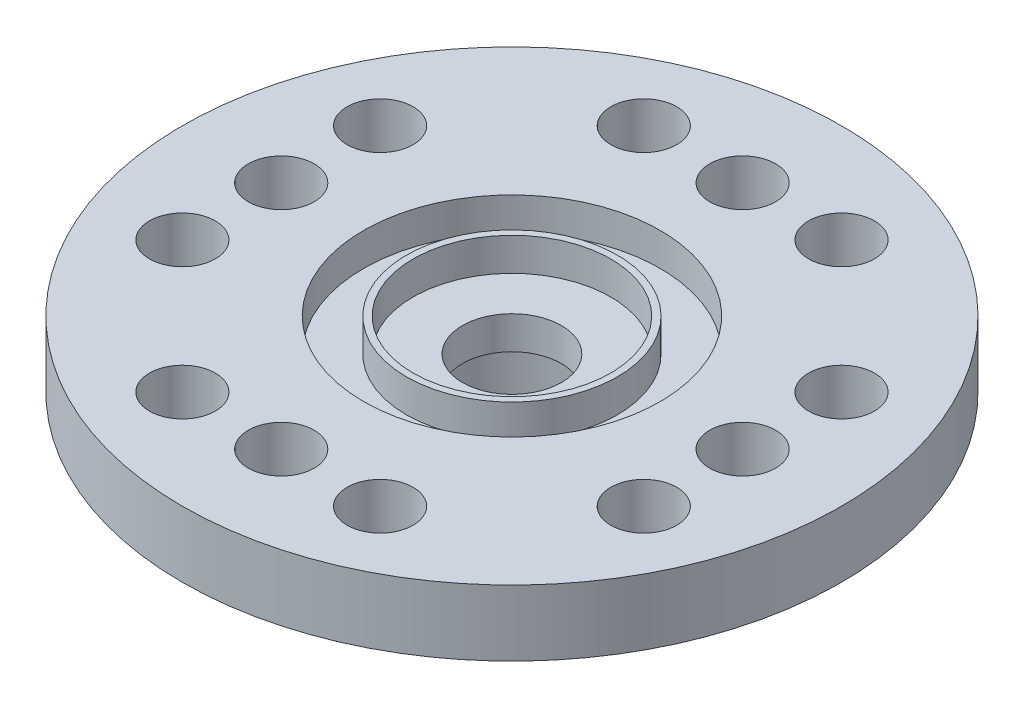
ISO-10303-21;
HEADER;
FILE_DESCRIPTION(('STEP AP214'),'2;1');
FILE_NAME('part.step','',(''),(''),'','','');
FILE_SCHEMA(('AUTOMOTIVE_DESIGN { 1 0 10303 214 1 1 1 1 }'));
ENDSEC;
DATA;
#1=APPLICATION_CONTEXT('core data for automotive mechanical design processes');
#2=APPLICATION_PROTOCOL_DEFINITION('international standard','automotive_design',2000,#1);
#3=PRODUCT_CONTEXT('',#1,'mechanical');
#4=PRODUCT('Part','Part','',(#3));
#5=PRODUCT_RELATED_PRODUCT_CATEGORY('part','',(#4));
#6=PRODUCT_DEFINITION_FORMATION('','',#4);
#7=PRODUCT_DEFINITION_CONTEXT('part definition',#1,'design');
#8=PRODUCT_DEFINITION('design','',#6,#7);
#9=PRODUCT_DEFINITION_SHAPE('','',#8);
#10=(LENGTH_UNIT() NAMED_UNIT(*) SI_UNIT(.MILLI.,.METRE.));
#11=(NAMED_UNIT(*) PLANE_ANGLE_UNIT() SI_UNIT($,.RADIAN.));
#12=(NAMED_UNIT(*) SI_UNIT($,.STERADIAN.) SOLID_ANGLE_UNIT());
#13=UNCERTAINTY_MEASURE_WITH_UNIT(LENGTH_MEASURE(1.E-05),#10,'distance_accuracy_value','');
#14=(GEOMETRIC_REPRESENTATION_CONTEXT(3) GLOBAL_UNCERTAINTY_ASSIGNED_CONTEXT((#13)) GLOBAL_UNIT_ASSIGNED_CONTEXT((#10,
#11,#12)) REPRESENTATION_CONTEXT('',''));
#15=CARTESIAN_POINT('',(0.,0.,0.));
#16=DIRECTION('',(0.,0.,1.));
#17=DIRECTION('',(1.,0.,0.));
#18=AXIS2_PLACEMENT_3D('',#15,#16,#17);
#19=CARTESIAN_POINT('',(0.,-0.00100000000000013,0.));
#20=DIRECTION('',(0.,1.,0.));
#21=DIRECTION('',(0.,0.,1.));
#22=AXIS2_PLACEMENT_3D('',#19,#20,#21);
#23=CYLINDRICAL_SURFACE('',#22,1.5);
#24=CARTESIAN_POINT('',(0.,3.,0.));
#25=DIRECTION('',(0.,1.,0.));
#26=DIRECTION('',(0.,0.,1.));
#27=AXIS2_PLACEMENT_3D('',#24,#25,#26);
#28=CIRCLE('',#27,1.5);
#29=CARTESIAN_POINT('',(0.,3.,1.5));
#30=VERTEX_POINT('',#29);
#31=EDGE_CURVE('E78',#30,#30,#28,.F.);
#32=ORIENTED_EDGE('',*,*,#31,.T.);
#33=EDGE_LOOP('',(#32));
#34=FACE_BOUND('',#33,.T.);
#35=CARTESIAN_POINT('',(0.,4.,0.));
#36=DIRECTION('',(0.,1.,0.));
#37=DIRECTION('',(0.,0.,1.));
#38=AXIS2_PLACEMENT_3D('',#35,#36,#37);
#39=CIRCLE('',#38,1.5);
#40=CARTESIAN_POINT('',(0.,4.,1.5));
#41=VERTEX_POINT('',#40);
#42=EDGE_CURVE('E159',#41,#41,#39,.F.);
#43=ORIENTED_EDGE('',*,*,#42,.F.);
#44=EDGE_LOOP('',(#43));
#45=FACE_BOUND('',#44,.T.);
#46=ADVANCED_FACE('F44',(#34,#45),#23,.F.);
#47=CARTESIAN_POINT('',(0.,0.,0.));
#48=DIRECTION('',(0.,1.,0.));
#49=DIRECTION('',(0.,0.,1.));
#50=AXIS2_PLACEMENT_3D('',#47,#48,#49);
#51=PLANE('',#50);
#52=CARTESIAN_POINT('',(0.,0.,0.));
#53=DIRECTION('',(0.,1.,0.));
#54=DIRECTION('',(0.,0.,1.));
#55=AXIS2_PLACEMENT_3D('',#52,#53,#54);
#56=CIRCLE('',#55,4.);
#57=CARTESIAN_POINT('',(0.,0.,4.));
#58=VERTEX_POINT('',#57);
#59=EDGE_CURVE('E48',#58,#58,#56,.T.);
#60=ORIENTED_EDGE('',*,*,#59,.F.);
#61=EDGE_LOOP('',(#60));
#62=FACE_BOUND('',#61,.T.);
#63=CARTESIAN_POINT('',(0.,0.,0.));
#64=DIRECTION('',(0.,1.,0.));
#65=DIRECTION('',(0.,0.,1.));
#66=AXIS2_PLACEMENT_3D('',#63,#64,#65);
#67=CIRCLE('',#66,3.);
#68=CARTESIAN_POINT('',(0.,0.,3.));
#69=VERTEX_POINT('',#68);
#70=EDGE_CURVE('E55',#69,#69,#67,.T.);
#71=ORIENTED_EDGE('',*,*,#70,.T.);
#72=EDGE_LOOP('',(#71));
#73=FACE_BOUND('',#72,.T.);
#74=ADVANCED_FACE('F169',(#62,#73),#51,.F.);
#75=CARTESIAN_POINT('',(0.,3.,0.));
#76=DIRECTION('',(0.,-1.,0.));
#77=DIRECTION('',(0.,0.,-1.));
#78=AXIS2_PLACEMENT_3D('',#75,#76,#77);
#79=CYLINDRICAL_SURFACE('',#78,4.);
#80=CARTESIAN_POINT('',(0.,3.,0.));
#81=DIRECTION('',(0.,1.,0.));
#82=DIRECTION('',(0.,0.,1.));
#83=AXIS2_PLACEMENT_3D('',#80,#81,#82);
#84=CIRCLE('',#83,4.);
#85=CARTESIAN_POINT('',(0.,3.,4.));
#86=VERTEX_POINT('',#85);
#87=EDGE_CURVE('E11',#86,#86,#84,.T.);
#88=ORIENTED_EDGE('',*,*,#87,.F.);
#89=EDGE_LOOP('',(#88));
#90=FACE_BOUND('',#89,.T.);
#91=ORIENTED_EDGE('',*,*,#59,.T.);
#92=EDGE_LOOP('',(#91));
#93=FACE_BOUND('',#92,.T.);
#94=ADVANCED_FACE('F46',(#90,#93),#79,.T.);
#95=CARTESIAN_POINT('',(0.,3.,0.));
#96=DIRECTION('',(0.,-1.,0.));
#97=DIRECTION('',(0.,0.,-1.));
#98=AXIS2_PLACEMENT_3D('',#95,#96,#97);
#99=CYLINDRICAL_SURFACE('',#98,3.);
#100=CARTESIAN_POINT('',(0.,3.,0.));
#101=DIRECTION('',(0.,1.,0.));
#102=DIRECTION('',(0.,0.,1.));
#103=AXIS2_PLACEMENT_3D('',#100,#101,#102);
#104=CIRCLE('',#103,3.);
#105=CARTESIAN_POINT('',(0.,3.,3.));
#106=VERTEX_POINT('',#105);
#107=EDGE_CURVE('E59',#106,#106,#104,.T.);
#108=ORIENTED_EDGE('',*,*,#107,.T.);
#109=EDGE_LOOP('',(#108));
#110=FACE_BOUND('',#109,.T.);
#111=ORIENTED_EDGE('',*,*,#70,.F.);
#112=EDGE_LOOP('',(#111));
#113=FACE_BOUND('',#112,.T.);
#114=ADVANCED_FACE('F205',(#110,#113),#99,.F.);
#115=CARTESIAN_POINT('',(0.,3.,0.));
#116=DIRECTION('',(0.,1.,0.));
#117=DIRECTION('',(0.,0.,1.));
#118=AXIS2_PLACEMENT_3D('',#115,#116,#117);
#119=PLANE('',#118);
#120=ORIENTED_EDGE('',*,*,#31,.F.);
#121=EDGE_LOOP('',(#120));
#122=FACE_BOUND('',#121,.T.);
#123=ORIENTED_EDGE('',*,*,#107,.F.);
#124=EDGE_LOOP('',(#123));
#125=FACE_BOUND('',#124,.T.);
#126=ADVANCED_FACE('F201',(#122,#125),#119,.F.);
#127=CARTESIAN_POINT('',(0.,5.,0.));
#128=DIRECTION('',(0.,-1.,0.));
#129=DIRECTION('',(0.,0.,-1.));
#130=AXIS2_PLACEMENT_3D('',#127,#128,#129);
#131=CYLINDRICAL_SURFACE('',#130,10.);
#132=CARTESIAN_POINT('',(0.,5.,0.));
#133=DIRECTION('',(0.,1.,0.));
#134=DIRECTION('',(0.,0.,1.));
#135=AXIS2_PLACEMENT_3D('',#132,#133,#134);
#136=CIRCLE('',#135,10.);
#137=CARTESIAN_POINT('',(0.,5.,10.));
#138=VERTEX_POINT('',#137);
#139=EDGE_CURVE('E62',#138,#138,#136,.T.);
#140=ORIENTED_EDGE('',*,*,#139,.F.);
#141=EDGE_LOOP('',(#140));
#142=FACE_BOUND('',#141,.T.);
#143=CARTESIAN_POINT('',(0.,3.,0.));
#144=DIRECTION('',(0.,1.,0.));
#145=DIRECTION('',(0.,0.,1.));
#146=AXIS2_PLACEMENT_3D('',#143,#144,#145);
#147=CIRCLE('',#146,10.);
#148=CARTESIAN_POINT('',(0.,3.,10.));
#149=VERTEX_POINT('',#148);
#150=EDGE_CURVE('E63',#149,#149,#147,.T.);
#151=ORIENTED_EDGE('',*,*,#150,.T.);
#152=EDGE_LOOP('',(#151));
#153=FACE_BOUND('',#152,.T.);
#154=ADVANCED_FACE('F195',(#142,#153),#131,.T.);
#155=CARTESIAN_POINT('',(0.,5.,0.));
#156=DIRECTION('',(0.,1.,0.));
#157=DIRECTION('',(0.,0.,1.));
#158=AXIS2_PLACEMENT_3D('',#155,#156,#157);
#159=PLANE('',#158);
#160=CARTESIAN_POINT('',(0.,5.,0.));
#161=DIRECTION('',(0.,1.,0.));
#162=DIRECTION('',(0.,0.,1.));
#163=AXIS2_PLACEMENT_3D('',#160,#161,#162);
#164=CIRCLE('',#163,4.5);
#165=CARTESIAN_POINT('',(0.,5.,4.5));
#166=VERTEX_POINT('',#165);
#167=EDGE_CURVE('E144',#166,#166,#164,.T.);
#168=ORIENTED_EDGE('',*,*,#167,.F.);
#169=EDGE_LOOP('',(#168));
#170=FACE_BOUND('',#169,.T.);
#171=CARTESIAN_POINT('',(-3.,5.,7.));
#172=DIRECTION('',(0.,1.,0.));
#173=DIRECTION('',(0.,0.,1.));
#174=AXIS2_PLACEMENT_3D('',#171,#172,#173);
#175=CIRCLE('',#174,1.00000000000004);
#176=CARTESIAN_POINT('',(-3.,5.,8.00000000000004));
#177=VERTEX_POINT('',#176);
#178=EDGE_CURVE('E100',#177,#177,#175,.T.);
#179=ORIENTED_EDGE('',*,*,#178,.F.);
#180=EDGE_LOOP('',(#179));
#181=FACE_BOUND('',#180,.T.);
#182=CARTESIAN_POINT('',(0.,5.,7.));
#183=DIRECTION('',(0.,1.,0.));
#184=DIRECTION('',(0.,0.,1.));
#185=AXIS2_PLACEMENT_3D('',#182,#183,#184);
#186=CIRCLE('',#185,1.00000000000005);
#187=CARTESIAN_POINT('',(0.,5.,8.00000000000005));
#188=VERTEX_POINT('',#187);
#189=EDGE_CURVE('E99',#188,#188,#186,.T.);
#190=ORIENTED_EDGE('',*,*,#189,.F.);
#191=EDGE_LOOP('',(#190));
#192=FACE_BOUND('',#191,.T.);
#193=CARTESIAN_POINT('',(7.,5.,-3.));
#194=DIRECTION('',(0.,1.,0.));
#195=DIRECTION('',(0.,0.,1.));
#196=AXIS2_PLACEMENT_3D('',#193,#194,#195);
#197=CIRCLE('',#196,1.00000000000003);
#198=CARTESIAN_POINT('',(7.,5.,-1.99999999999997));
#199=VERTEX_POINT('',#198);
#200=EDGE_CURVE('E107',#199,#199,#197,.T.);
#201=ORIENTED_EDGE('',*,*,#200,.F.);
#202=EDGE_LOOP('',(#201));
#203=FACE_BOUND('',#202,.T.);
#204=CARTESIAN_POINT('',(7.,5.,3.));
#205=DIRECTION('',(0.,1.,0.));
#206=DIRECTION('',(0.,0.,1.));
#207=AXIS2_PLACEMENT_3D('',#204,#205,#206);
#208=CIRCLE('',#207,1.00000000000002);
#209=CARTESIAN_POINT('',(7.,5.,4.00000000000002));
#210=VERTEX_POINT('',#209);
#211=EDGE_CURVE('E113',#210,#210,#208,.T.);
#212=ORIENTED_EDGE('',*,*,#211,.F.);
#213=EDGE_LOOP('',(#212));
#214=FACE_BOUND('',#213,.T.);
#215=CARTESIAN_POINT('',(7.,5.,0.));
#216=DIRECTION('',(0.,1.,0.));
#217=DIRECTION('',(0.,0.,1.));
#218=AXIS2_PLACEMENT_3D('',#215,#216,#217);
#219=CIRCLE('',#218,1.00000000000002);
#220=CARTESIAN_POINT('',(7.,5.,1.00000000000002));
#221=VERTEX_POINT('',#220);
#222=EDGE_CURVE('E79',#221,#221,#219,.T.);
#223=ORIENTED_EDGE('',*,*,#222,.F.);
#224=EDGE_LOOP('',(#223));
#225=FACE_BOUND('',#224,.T.);
#226=CARTESIAN_POINT('',(-3.,5.,-7.));
#227=DIRECTION('',(0.,1.,0.));
#228=DIRECTION('',(0.,0.,1.));
#229=AXIS2_PLACEMENT_3D('',#226,#227,#228);
#230=CIRCLE('',#229,1.);
#231=CARTESIAN_POINT('',(-3.,5.,-6.));
#232=VERTEX_POINT('',#231);
#233=EDGE_CURVE('E85',#232,#232,#230,.T.);
#234=ORIENTED_EDGE('',*,*,#233,.F.);
#235=EDGE_LOOP('',(#234));
#236=FACE_BOUND('',#235,.T.);
#237=CARTESIAN_POINT('',(3.,5.,-7.));
#238=DIRECTION('',(0.,1.,0.));
#239=DIRECTION('',(0.,0.,1.));
#240=AXIS2_PLACEMENT_3D('',#237,#238,#239);
#241=CIRCLE('',#240,1.);
#242=CARTESIAN_POINT('',(3.,5.,-6.));
#243=VERTEX_POINT('',#242);
#244=EDGE_CURVE('E89',#243,#243,#241,.T.);
#245=ORIENTED_EDGE('',*,*,#244,.F.);
#246=EDGE_LOOP('',(#245));
#247=FACE_BOUND('',#246,.T.);
#248=CARTESIAN_POINT('',(-7.,5.,3.));
#249=DIRECTION('',(0.,1.,0.));
#250=DIRECTION('',(0.,0.,1.));
#251=AXIS2_PLACEMENT_3D('',#248,#249,#250);
#252=CIRCLE('',#251,1.00000000000008);
#253=CARTESIAN_POINT('',(-7.,5.,4.00000000000008));
#254=VERTEX_POINT('',#253);
#255=EDGE_CURVE('E136',#254,#254,#252,.T.);
#256=ORIENTED_EDGE('',*,*,#255,.F.);
#257=EDGE_LOOP('',(#256));
#258=FACE_BOUND('',#257,.T.);
#259=CARTESIAN_POINT('',(-7.,5.,-3.));
#260=DIRECTION('',(0.,1.,0.));
#261=DIRECTION('',(0.,0.,1.));
#262=AXIS2_PLACEMENT_3D('',#259,#260,#261);
#263=CIRCLE('',#262,1.00000000000006);
#264=CARTESIAN_POINT('',(-7.,5.,-1.99999999999994));
#265=VERTEX_POINT('',#264);
#266=EDGE_CURVE('E135',#265,#265,#263,.T.);
#267=ORIENTED_EDGE('',*,*,#266,.F.);
#268=EDGE_LOOP('',(#267));
#269=FACE_BOUND('',#268,.T.);
#270=CARTESIAN_POINT('',(-7.,5.,0.));
#271=DIRECTION('',(0.,1.,0.));
#272=DIRECTION('',(0.,0.,1.));
#273=AXIS2_PLACEMENT_3D('',#270,#271,#272);
#274=CIRCLE('',#273,1.00000000000007);
#275=CARTESIAN_POINT('',(-7.,5.,1.00000000000007));
#276=VERTEX_POINT('',#275);
#277=EDGE_CURVE('E124',#276,#276,#274,.T.);
#278=ORIENTED_EDGE('',*,*,#277,.F.);
#279=EDGE_LOOP('',(#278));
#280=FACE_BOUND('',#279,.T.);
#281=CARTESIAN_POINT('',(3.,5.,7.));
#282=DIRECTION('',(0.,1.,0.));
#283=DIRECTION('',(0.,0.,1.));
#284=AXIS2_PLACEMENT_3D('',#281,#282,#283);
#285=CIRCLE('',#284,1.00000000000005);
#286=CARTESIAN_POINT('',(3.,5.,8.00000000000005));
#287=VERTEX_POINT('',#286);
#288=EDGE_CURVE('E123',#287,#287,#285,.T.);
#289=ORIENTED_EDGE('',*,*,#288,.F.);
#290=EDGE_LOOP('',(#289));
#291=FACE_BOUND('',#290,.T.);
#292=CARTESIAN_POINT('',(0.,5.,-7.));
#293=DIRECTION('',(0.,1.,0.));
#294=DIRECTION('',(0.,0.,1.));
#295=AXIS2_PLACEMENT_3D('',#292,#293,#294);
#296=CIRCLE('',#295,1.);
#297=CARTESIAN_POINT('',(0.,5.,-6.));
#298=VERTEX_POINT('',#297);
#299=EDGE_CURVE('E71',#298,#298,#296,.T.);
#300=ORIENTED_EDGE('',*,*,#299,.F.);
#301=EDGE_LOOP('',(#300));
#302=FACE_BOUND('',#301,.T.);
#303=ORIENTED_EDGE('',*,*,#139,.T.);
#304=EDGE_LOOP('',(#303));
#305=FACE_BOUND('',#304,.T.);
#306=ADVANCED_FACE('F193',(#170,#181,#192,#203,#214,#225,#236,#247,#258,#269,#280,#291,#302,
#305),#159,.T.);
#307=CARTESIAN_POINT('',(-3.,3.,7.));
#308=DIRECTION('',(0.,1.,0.));
#309=DIRECTION('',(0.,0.,1.));
#310=AXIS2_PLACEMENT_3D('',#307,#308,#309);
#311=CIRCLE('',#310,1.00000000000004);
#312=CARTESIAN_POINT('',(-3.,3.,8.00000000000004));
#313=VERTEX_POINT('',#312);
#314=EDGE_CURVE('E96',#313,#313,#311,.F.);
#315=ORIENTED_EDGE('',*,*,#314,.F.);
#316=EDGE_LOOP('',(#315));
#317=FACE_BOUND('',#316,.T.);
#318=CARTESIAN_POINT('',(0.,3.,7.));
#319=DIRECTION('',(0.,1.,0.));
#320=DIRECTION('',(0.,0.,1.));
#321=AXIS2_PLACEMENT_3D('',#318,#319,#320);
#322=CIRCLE('',#321,1.00000000000005);
#323=CARTESIAN_POINT('',(0.,3.,8.00000000000005));
#324=VERTEX_POINT('',#323);
#325=EDGE_CURVE('E104',#324,#324,#322,.F.);
#326=ORIENTED_EDGE('',*,*,#325,.F.);
#327=EDGE_LOOP('',(#326));
#328=FACE_BOUND('',#327,.T.);
#329=CARTESIAN_POINT('',(7.,3.,-3.));
#330=DIRECTION('',(0.,1.,0.));
#331=DIRECTION('',(0.,0.,1.));
#332=AXIS2_PLACEMENT_3D('',#329,#330,#331);
#333=CIRCLE('',#332,1.00000000000003);
#334=CARTESIAN_POINT('',(7.,3.,-1.99999999999997));
#335=VERTEX_POINT('',#334);
#336=EDGE_CURVE('E110',#335,#335,#333,.F.);
#337=ORIENTED_EDGE('',*,*,#336,.F.);
#338=EDGE_LOOP('',(#337));
#339=FACE_BOUND('',#338,.T.);
#340=CARTESIAN_POINT('',(7.,3.,3.));
#341=DIRECTION('',(0.,1.,0.));
#342=DIRECTION('',(0.,0.,1.));
#343=AXIS2_PLACEMENT_3D('',#340,#341,#342);
#344=CIRCLE('',#343,1.00000000000002);
#345=CARTESIAN_POINT('',(7.,3.,4.00000000000002));
#346=VERTEX_POINT('',#345);
#347=EDGE_CURVE('E82',#346,#346,#344,.F.);
#348=ORIENTED_EDGE('',*,*,#347,.F.);
#349=EDGE_LOOP('',(#348));
#350=FACE_BOUND('',#349,.T.);
#351=CARTESIAN_POINT('',(7.,3.,0.));
#352=DIRECTION('',(0.,1.,0.));
#353=DIRECTION('',(0.,0.,1.));
#354=AXIS2_PLACEMENT_3D('',#351,#352,#353);
#355=CIRCLE('',#354,1.00000000000002);
#356=CARTESIAN_POINT('',(7.,3.,1.00000000000002));
#357=VERTEX_POINT('',#356);
#358=EDGE_CURVE('E75',#357,#357,#355,.F.);
#359=ORIENTED_EDGE('',*,*,#358,.F.);
#360=EDGE_LOOP('',(#359));
#361=FACE_BOUND('',#360,.T.);
#362=CARTESIAN_POINT('',(-3.,3.,-7.));
#363=DIRECTION('',(0.,1.,0.));
#364=DIRECTION('',(0.,0.,1.));
#365=AXIS2_PLACEMENT_3D('',#362,#363,#364);
#366=CIRCLE('',#365,1.);
#367=CARTESIAN_POINT('',(-3.,3.,-6.));
#368=VERTEX_POINT('',#367);
#369=EDGE_CURVE('E86',#368,#368,#366,.F.);
#370=ORIENTED_EDGE('',*,*,#369,.F.);
#371=EDGE_LOOP('',(#370));
#372=FACE_BOUND('',#371,.T.);
#373=CARTESIAN_POINT('',(3.,3.,-7.));
#374=DIRECTION('',(0.,1.,0.));
#375=DIRECTION('',(0.,0.,1.));
#376=AXIS2_PLACEMENT_3D('',#373,#374,#375);
#377=CIRCLE('',#376,1.);
#378=CARTESIAN_POINT('',(3.,3.,-6.));
#379=VERTEX_POINT('',#378);
#380=EDGE_CURVE('E74',#379,#379,#377,.F.);
#381=ORIENTED_EDGE('',*,*,#380,.F.);
#382=EDGE_LOOP('',(#381));
#383=FACE_BOUND('',#382,.T.);
#384=CARTESIAN_POINT('',(-7.,3.,3.));
#385=DIRECTION('',(0.,1.,0.));
#386=DIRECTION('',(0.,0.,1.));
#387=AXIS2_PLACEMENT_3D('',#384,#385,#386);
#388=CIRCLE('',#387,1.00000000000008);
#389=CARTESIAN_POINT('',(-7.,3.,4.00000000000008));
#390=VERTEX_POINT('',#389);
#391=EDGE_CURVE('E132',#390,#390,#388,.F.);
#392=ORIENTED_EDGE('',*,*,#391,.F.);
#393=EDGE_LOOP('',(#392));
#394=FACE_BOUND('',#393,.T.);
#395=CARTESIAN_POINT('',(-7.,3.,-3.));
#396=DIRECTION('',(0.,1.,0.));
#397=DIRECTION('',(0.,0.,1.));
#398=AXIS2_PLACEMENT_3D('',#395,#396,#397);
#399=CIRCLE('',#398,1.00000000000006);
#400=CARTESIAN_POINT('',(-7.,3.,-1.99999999999994));
#401=VERTEX_POINT('',#400);
#402=EDGE_CURVE('E127',#401,#401,#399,.F.);
#403=ORIENTED_EDGE('',*,*,#402,.F.);
#404=EDGE_LOOP('',(#403));
#405=FACE_BOUND('',#404,.T.);
#406=CARTESIAN_POINT('',(-7.,3.,0.));
#407=DIRECTION('',(0.,1.,0.));
#408=DIRECTION('',(0.,0.,1.));
#409=AXIS2_PLACEMENT_3D('',#406,#407,#408);
#410=CIRCLE('',#409,1.00000000000007);
#411=CARTESIAN_POINT('',(-7.,3.,1.00000000000007));
#412=VERTEX_POINT('',#411);
#413=EDGE_CURVE('E120',#412,#412,#410,.F.);
#414=ORIENTED_EDGE('',*,*,#413,.F.);
#415=EDGE_LOOP('',(#414));
#416=FACE_BOUND('',#415,.T.);
#417=CARTESIAN_POINT('',(3.,3.,7.));
#418=DIRECTION('',(0.,1.,0.));
#419=DIRECTION('',(0.,0.,1.));
#420=AXIS2_PLACEMENT_3D('',#417,#418,#419);
#421=CIRCLE('',#420,1.00000000000005);
#422=CARTESIAN_POINT('',(3.,3.,8.00000000000005));
#423=VERTEX_POINT('',#422);
#424=EDGE_CURVE('E103',#423,#423,#421,.F.);
#425=ORIENTED_EDGE('',*,*,#424,.F.);
#426=EDGE_LOOP('',(#425));
#427=FACE_BOUND('',#426,.T.);
#428=CARTESIAN_POINT('',(0.,3.,-7.));
#429=DIRECTION('',(0.,1.,0.));
#430=DIRECTION('',(0.,0.,1.));
#431=AXIS2_PLACEMENT_3D('',#428,#429,#430);
#432=CIRCLE('',#431,1.);
#433=CARTESIAN_POINT('',(0.,3.,-6.));
#434=VERTEX_POINT('',#433);
#435=EDGE_CURVE('E66',#434,#434,#432,.F.);
#436=ORIENTED_EDGE('',*,*,#435,.F.);
#437=EDGE_LOOP('',(#436));
#438=FACE_BOUND('',#437,.T.);
#439=ORIENTED_EDGE('',*,*,#87,.T.);
#440=EDGE_LOOP('',(#439));
#441=FACE_BOUND('',#440,.T.);
#442=ORIENTED_EDGE('',*,*,#150,.F.);
#443=EDGE_LOOP('',(#442));
#444=FACE_BOUND('',#443,.T.);
#445=ADVANCED_FACE('F191',(#317,#328,#339,#350,#361,#372,#383,#394,#405,#416,#427,#438,#441,
#444),#119,.F.);
#446=CARTESIAN_POINT('',(0.,-0.00100000000000013,-7.));
#447=DIRECTION('',(0.,1.,0.));
#448=DIRECTION('',(0.,0.,1.));
#449=AXIS2_PLACEMENT_3D('',#446,#447,#448);
#450=CYLINDRICAL_SURFACE('',#449,1.);
#451=ORIENTED_EDGE('',*,*,#299,.T.);
#452=EDGE_LOOP('',(#451));
#453=FACE_BOUND('',#452,.T.);
#454=ORIENTED_EDGE('',*,*,#435,.T.);
#455=EDGE_LOOP('',(#454));
#456=FACE_BOUND('',#455,.T.);
#457=ADVANCED_FACE('F187',(#453,#456),#450,.F.);
#458=CARTESIAN_POINT('',(3.,-0.00100000000000013,7.));
#459=DIRECTION('',(0.,1.,0.));
#460=DIRECTION('',(0.,0.,1.));
#461=AXIS2_PLACEMENT_3D('',#458,#459,#460);
#462=CYLINDRICAL_SURFACE('',#461,1.00000000000005);
#463=ORIENTED_EDGE('',*,*,#288,.T.);
#464=EDGE_LOOP('',(#463));
#465=FACE_BOUND('',#464,.T.);
#466=ORIENTED_EDGE('',*,*,#424,.T.);
#467=EDGE_LOOP('',(#466));
#468=FACE_BOUND('',#467,.T.);
#469=ADVANCED_FACE('F190',(#465,#468),#462,.F.);
#470=CARTESIAN_POINT('',(-7.,-0.00100000000000013,0.));
#471=DIRECTION('',(0.,1.,0.));
#472=DIRECTION('',(0.,0.,1.));
#473=AXIS2_PLACEMENT_3D('',#470,#471,#472);
#474=CYLINDRICAL_SURFACE('',#473,1.00000000000007);
#475=ORIENTED_EDGE('',*,*,#277,.T.);
#476=EDGE_LOOP('',(#475));
#477=FACE_BOUND('',#476,.T.);
#478=ORIENTED_EDGE('',*,*,#413,.T.);
#479=EDGE_LOOP('',(#478));
#480=FACE_BOUND('',#479,.T.);
#481=ADVANCED_FACE('F268',(#477,#480),#474,.F.);
#482=CARTESIAN_POINT('',(-7.,-0.00100000000000013,-3.));
#483=DIRECTION('',(0.,1.,0.));
#484=DIRECTION('',(0.,0.,1.));
#485=AXIS2_PLACEMENT_3D('',#482,#483,#484);
#486=CYLINDRICAL_SURFACE('',#485,1.00000000000006);
#487=ORIENTED_EDGE('',*,*,#266,.T.);
#488=EDGE_LOOP('',(#487));
#489=FACE_BOUND('',#488,.T.);
#490=ORIENTED_EDGE('',*,*,#402,.T.);
#491=EDGE_LOOP('',(#490));
#492=FACE_BOUND('',#491,.T.);
#493=ADVANCED_FACE('F277',(#489,#492),#486,.F.);
#494=CARTESIAN_POINT('',(-7.,-0.00100000000000013,3.));
#495=DIRECTION('',(0.,1.,0.));
#496=DIRECTION('',(0.,0.,1.));
#497=AXIS2_PLACEMENT_3D('',#494,#495,#496);
#498=CYLINDRICAL_SURFACE('',#497,1.00000000000008);
#499=ORIENTED_EDGE('',*,*,#255,.T.);
#500=EDGE_LOOP('',(#499));
#501=FACE_BOUND('',#500,.T.);
#502=ORIENTED_EDGE('',*,*,#391,.T.);
#503=EDGE_LOOP('',(#502));
#504=FACE_BOUND('',#503,.T.);
#505=ADVANCED_FACE('F286',(#501,#504),#498,.F.);
#506=CARTESIAN_POINT('',(3.,-0.00100000000000013,-7.));
#507=DIRECTION('',(0.,1.,0.));
#508=DIRECTION('',(0.,0.,1.));
#509=AXIS2_PLACEMENT_3D('',#506,#507,#508);
#510=CYLINDRICAL_SURFACE('',#509,1.);
#511=ORIENTED_EDGE('',*,*,#244,.T.);
#512=EDGE_LOOP('',(#511));
#513=FACE_BOUND('',#512,.T.);
#514=ORIENTED_EDGE('',*,*,#380,.T.);
#515=EDGE_LOOP('',(#514));
#516=FACE_BOUND('',#515,.T.);
#517=ADVANCED_FACE('F295',(#513,#516),#510,.F.);
#518=CARTESIAN_POINT('',(-3.,-0.00100000000000013,-7.));
#519=DIRECTION('',(0.,1.,0.));
#520=DIRECTION('',(0.,0.,1.));
#521=AXIS2_PLACEMENT_3D('',#518,#519,#520);
#522=CYLINDRICAL_SURFACE('',#521,1.);
#523=ORIENTED_EDGE('',*,*,#233,.T.);
#524=EDGE_LOOP('',(#523));
#525=FACE_BOUND('',#524,.T.);
#526=ORIENTED_EDGE('',*,*,#369,.T.);
#527=EDGE_LOOP('',(#526));
#528=FACE_BOUND('',#527,.T.);
#529=ADVANCED_FACE('F180',(#525,#528),#522,.F.);
#530=CARTESIAN_POINT('',(7.,-0.00100000000000013,0.));
#531=DIRECTION('',(0.,1.,0.));
#532=DIRECTION('',(0.,0.,1.));
#533=AXIS2_PLACEMENT_3D('',#530,#531,#532);
#534=CYLINDRICAL_SURFACE('',#533,1.00000000000002);
#535=ORIENTED_EDGE('',*,*,#222,.T.);
#536=EDGE_LOOP('',(#535));
#537=FACE_BOUND('',#536,.T.);
#538=ORIENTED_EDGE('',*,*,#358,.T.);
#539=EDGE_LOOP('',(#538));
#540=FACE_BOUND('',#539,.T.);
#541=ADVANCED_FACE('F182',(#537,#540),#534,.F.);
#542=CARTESIAN_POINT('',(7.,-0.00100000000000013,3.));
#543=DIRECTION('',(0.,1.,0.));
#544=DIRECTION('',(0.,0.,1.));
#545=AXIS2_PLACEMENT_3D('',#542,#543,#544);
#546=CYLINDRICAL_SURFACE('',#545,1.00000000000002);
#547=ORIENTED_EDGE('',*,*,#211,.T.);
#548=EDGE_LOOP('',(#547));
#549=FACE_BOUND('',#548,.T.);
#550=ORIENTED_EDGE('',*,*,#347,.T.);
#551=EDGE_LOOP('',(#550));
#552=FACE_BOUND('',#551,.T.);
#553=ADVANCED_FACE('F185',(#549,#552),#546,.F.);
#554=CARTESIAN_POINT('',(7.,-0.00100000000000013,-3.));
#555=DIRECTION('',(0.,1.,0.));
#556=DIRECTION('',(0.,0.,1.));
#557=AXIS2_PLACEMENT_3D('',#554,#555,#556);
#558=CYLINDRICAL_SURFACE('',#557,1.00000000000003);
#559=ORIENTED_EDGE('',*,*,#200,.T.);
#560=EDGE_LOOP('',(#559));
#561=FACE_BOUND('',#560,.T.);
#562=ORIENTED_EDGE('',*,*,#336,.T.);
#563=EDGE_LOOP('',(#562));
#564=FACE_BOUND('',#563,.T.);
#565=ADVANCED_FACE('F323',(#561,#564),#558,.F.);
#566=CARTESIAN_POINT('',(0.,-0.00100000000000013,7.));
#567=DIRECTION('',(0.,1.,0.));
#568=DIRECTION('',(0.,0.,1.));
#569=AXIS2_PLACEMENT_3D('',#566,#567,#568);
#570=CYLINDRICAL_SURFACE('',#569,1.00000000000005);
#571=ORIENTED_EDGE('',*,*,#189,.T.);
#572=EDGE_LOOP('',(#571));
#573=FACE_BOUND('',#572,.T.);
#574=ORIENTED_EDGE('',*,*,#325,.T.);
#575=EDGE_LOOP('',(#574));
#576=FACE_BOUND('',#575,.T.);
#577=ADVANCED_FACE('F332',(#573,#576),#570,.F.);
#578=CARTESIAN_POINT('',(-3.,-0.00100000000000013,7.));
#579=DIRECTION('',(0.,1.,0.));
#580=DIRECTION('',(0.,0.,1.));
#581=AXIS2_PLACEMENT_3D('',#578,#579,#580);
#582=CYLINDRICAL_SURFACE('',#581,1.00000000000004);
#583=ORIENTED_EDGE('',*,*,#178,.T.);
#584=EDGE_LOOP('',(#583));
#585=FACE_BOUND('',#584,.T.);
#586=ORIENTED_EDGE('',*,*,#314,.T.);
#587=EDGE_LOOP('',(#586));
#588=FACE_BOUND('',#587,.T.);
#589=ADVANCED_FACE('F341',(#585,#588),#582,.F.);
#590=CARTESIAN_POINT('',(0.,4.,0.));
#591=DIRECTION('',(0.,1.,0.));
#592=DIRECTION('',(0.,0.,1.));
#593=AXIS2_PLACEMENT_3D('',#590,#591,#592);
#594=CYLINDRICAL_SURFACE('',#593,3.);
#595=CARTESIAN_POINT('',(0.,4.,0.));
#596=DIRECTION('',(0.,1.,0.));
#597=DIRECTION('',(0.,0.,1.));
#598=AXIS2_PLACEMENT_3D('',#595,#596,#597);
#599=CIRCLE('',#598,3.);
#600=CARTESIAN_POINT('',(0.,4.,3.));
#601=VERTEX_POINT('',#600);
#602=EDGE_CURVE('E151',#601,#601,#599,.T.);
#603=ORIENTED_EDGE('',*,*,#602,.F.);
#604=EDGE_LOOP('',(#603));
#605=FACE_BOUND('',#604,.T.);
#606=CARTESIAN_POINT('',(0.,5.,0.));
#607=DIRECTION('',(0.,1.,0.));
#608=DIRECTION('',(0.,0.,1.));
#609=AXIS2_PLACEMENT_3D('',#606,#607,#608);
#610=CIRCLE('',#609,3.);
#611=CARTESIAN_POINT('',(0.,5.,3.));
#612=VERTEX_POINT('',#611);
#613=EDGE_CURVE('E156',#612,#612,#610,.T.);
#614=ORIENTED_EDGE('',*,*,#613,.T.);
#615=EDGE_LOOP('',(#614));
#616=FACE_BOUND('',#615,.T.);
#617=ADVANCED_FACE('F348',(#605,#616),#594,.F.);
#618=CARTESIAN_POINT('',(0.,4.,0.));
#619=DIRECTION('',(0.,1.,0.));
#620=DIRECTION('',(0.,0.,1.));
#621=AXIS2_PLACEMENT_3D('',#618,#619,#620);
#622=PLANE('',#621);
#623=ORIENTED_EDGE('',*,*,#42,.T.);
#624=EDGE_LOOP('',(#623));
#625=FACE_BOUND('',#624,.T.);
#626=ORIENTED_EDGE('',*,*,#602,.T.);
#627=EDGE_LOOP('',(#626));
#628=FACE_BOUND('',#627,.T.);
#629=ADVANCED_FACE('F165',(#625,#628),#622,.T.);
#630=CARTESIAN_POINT('',(0.,4.,0.));
#631=DIRECTION('',(0.,1.,0.));
#632=DIRECTION('',(0.,0.,1.));
#633=AXIS2_PLACEMENT_3D('',#630,#631,#632);
#634=CYLINDRICAL_SURFACE('',#633,3.2);
#635=CARTESIAN_POINT('',(0.,4.,0.));
#636=DIRECTION('',(0.,1.,0.));
#637=DIRECTION('',(0.,0.,1.));
#638=AXIS2_PLACEMENT_3D('',#635,#636,#637);
#639=CIRCLE('',#638,3.2);
#640=CARTESIAN_POINT('',(0.,4.,3.2));
#641=VERTEX_POINT('',#640);
#642=EDGE_CURVE('E147',#641,#641,#639,.T.);
#643=ORIENTED_EDGE('',*,*,#642,.T.);
#644=EDGE_LOOP('',(#643));
#645=FACE_BOUND('',#644,.T.);
#646=CARTESIAN_POINT('',(0.,5.,0.));
#647=DIRECTION('',(0.,1.,0.));
#648=DIRECTION('',(0.,0.,1.));
#649=AXIS2_PLACEMENT_3D('',#646,#647,#648);
#650=CIRCLE('',#649,3.2);
#651=CARTESIAN_POINT('',(0.,5.,3.2));
#652=VERTEX_POINT('',#651);
#653=EDGE_CURVE('E148',#652,#652,#650,.T.);
#654=ORIENTED_EDGE('',*,*,#653,.F.);
#655=EDGE_LOOP('',(#654));
#656=FACE_BOUND('',#655,.T.);
#657=ADVANCED_FACE('F378',(#645,#656),#634,.T.);
#658=CARTESIAN_POINT('',(0.,4.,0.));
#659=DIRECTION('',(0.,1.,0.));
#660=DIRECTION('',(0.,0.,1.));
#661=AXIS2_PLACEMENT_3D('',#658,#659,#660);
#662=CYLINDRICAL_SURFACE('',#661,4.5);
#663=CARTESIAN_POINT('',(0.,4.,0.));
#664=DIRECTION('',(0.,1.,0.));
#665=DIRECTION('',(0.,0.,1.));
#666=AXIS2_PLACEMENT_3D('',#663,#664,#665);
#667=CIRCLE('',#666,4.5);
#668=CARTESIAN_POINT('',(0.,4.,4.5));
#669=VERTEX_POINT('',#668);
#670=EDGE_CURVE('E139',#669,#669,#667,.T.);
#671=ORIENTED_EDGE('',*,*,#670,.F.);
#672=EDGE_LOOP('',(#671));
#673=FACE_BOUND('',#672,.T.);
#674=ORIENTED_EDGE('',*,*,#167,.T.);
#675=EDGE_LOOP('',(#674));
#676=FACE_BOUND('',#675,.T.);
#677=ADVANCED_FACE('F386',(#673,#676),#662,.F.);
#678=CARTESIAN_POINT('',(0.,4.,0.));
#679=DIRECTION('',(0.,1.,0.));
#680=DIRECTION('',(0.,0.,1.));
#681=AXIS2_PLACEMENT_3D('',#678,#679,#680);
#682=PLANE('',#681);
#683=ORIENTED_EDGE('',*,*,#642,.F.);
#684=EDGE_LOOP('',(#683));
#685=FACE_BOUND('',#684,.T.);
#686=ORIENTED_EDGE('',*,*,#670,.T.);
#687=EDGE_LOOP('',(#686));
#688=FACE_BOUND('',#687,.T.);
#689=ADVANCED_FACE('F362',(#685,#688),#682,.T.);
#690=ORIENTED_EDGE('',*,*,#613,.F.);
#691=EDGE_LOOP('',(#690));
#692=FACE_BOUND('',#691,.T.);
#693=ORIENTED_EDGE('',*,*,#653,.T.);
#694=EDGE_LOOP('',(#693));
#695=FACE_BOUND('',#694,.T.);
#696=ADVANCED_FACE('F197',(#692,#695),#159,.T.);
#697=CLOSED_SHELL('',(#46,#74,#94,#114,#126,#154,#306,#445,#457,#469,#481,#493,#505,#517,#529,
#541,#553,#565,#577,#589,#617,#629,#657,#677,#689,#696));
#698=MANIFOLD_SOLID_BREP('B2',#697);
#699=ADVANCED_BREP_SHAPE_REPRESENTATION('',(#18,#698),#14);
#700=SHAPE_DEFINITION_REPRESENTATION(#9,#699);
ENDSEC;
END-ISO-10303-21;
